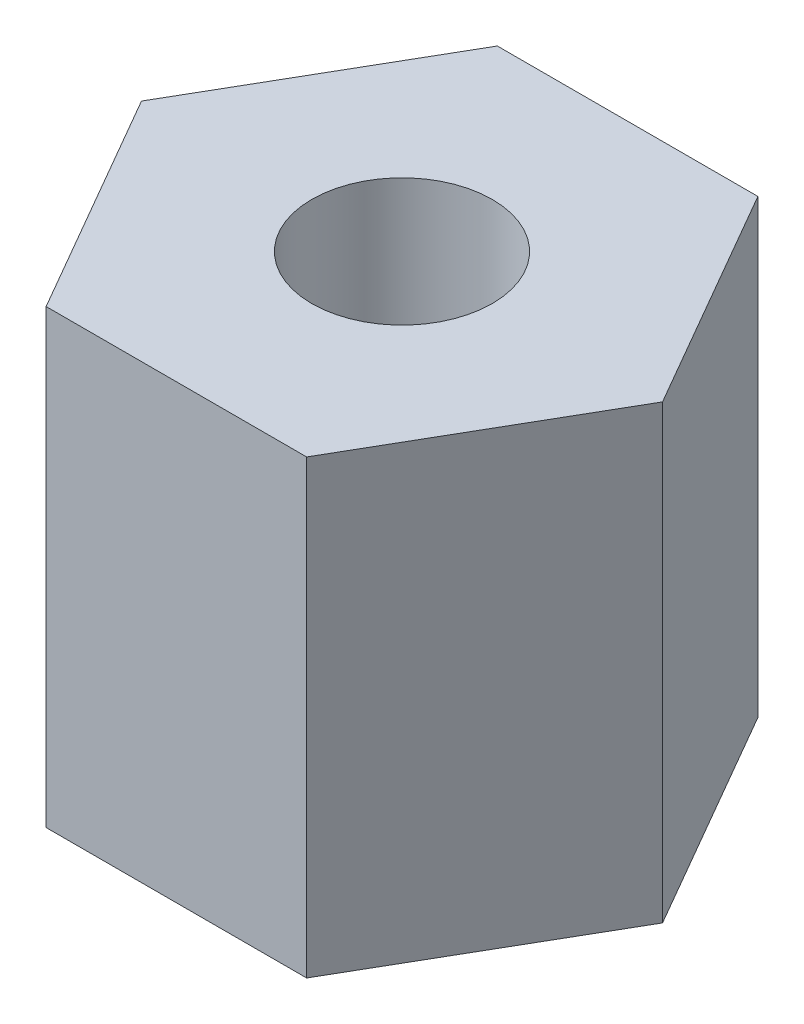
ISO-10303-21;
HEADER;
FILE_DESCRIPTION(('STEP AP214'),'2;1');
FILE_NAME('part.step','',(''),(''),'','','');
FILE_SCHEMA(('AUTOMOTIVE_DESIGN { 1 0 10303 214 1 1 1 1 }'));
ENDSEC;
DATA;
#1=APPLICATION_CONTEXT('core data for automotive mechanical design processes');
#2=APPLICATION_PROTOCOL_DEFINITION('international standard','automotive_design',2000,#1);
#3=PRODUCT_CONTEXT('',#1,'mechanical');
#4=PRODUCT('Part','Part','',(#3));
#5=PRODUCT_RELATED_PRODUCT_CATEGORY('part','',(#4));
#6=PRODUCT_DEFINITION_FORMATION('','',#4);
#7=PRODUCT_DEFINITION_CONTEXT('part definition',#1,'design');
#8=PRODUCT_DEFINITION('design','',#6,#7);
#9=PRODUCT_DEFINITION_SHAPE('','',#8);
#10=(LENGTH_UNIT() NAMED_UNIT(*) SI_UNIT(.MILLI.,.METRE.));
#11=(NAMED_UNIT(*) PLANE_ANGLE_UNIT() SI_UNIT($,.RADIAN.));
#12=(NAMED_UNIT(*) SI_UNIT($,.STERADIAN.) SOLID_ANGLE_UNIT());
#13=UNCERTAINTY_MEASURE_WITH_UNIT(LENGTH_MEASURE(1.E-05),#10,'distance_accuracy_value','');
#14=(GEOMETRIC_REPRESENTATION_CONTEXT(3) GLOBAL_UNCERTAINTY_ASSIGNED_CONTEXT((#13)) GLOBAL_UNIT_ASSIGNED_CONTEXT((#10,
#11,#12)) REPRESENTATION_CONTEXT('',''));
#15=CARTESIAN_POINT('',(0.,0.,0.));
#16=DIRECTION('',(0.,0.,1.));
#17=DIRECTION('',(1.,0.,0.));
#18=AXIS2_PLACEMENT_3D('',#15,#16,#17);
#19=CARTESIAN_POINT('',(14.4337567297407,50.,-25.));
#20=DIRECTION('',(0.,0.,1.));
#21=DIRECTION('',(1.,0.,0.));
#22=AXIS2_PLACEMENT_3D('',#19,#20,#21);
#23=PLANE('',#22);
#24=DIRECTION('',(-1.,0.,0.));
#25=VECTOR('',#24,1.);
#26=CARTESIAN_POINT('',(14.4337567297407,0.,-25.));
#27=LINE('',#26,#25);
#28=CARTESIAN_POINT('',(14.4337567297407,0.,-25.));
#29=VERTEX_POINT('',#28);
#30=CARTESIAN_POINT('',(-14.4337567297407,0.,-25.));
#31=VERTEX_POINT('',#30);
#32=EDGE_CURVE('E134',#29,#31,#27,.T.);
#33=ORIENTED_EDGE('',*,*,#32,.T.);
#34=DIRECTION('',(0.,-1.,0.));
#35=VECTOR('',#34,1.);
#36=CARTESIAN_POINT('',(-14.4337567297407,50.,-25.));
#37=LINE('',#36,#35);
#38=CARTESIAN_POINT('',(-14.4337567297407,50.,-25.));
#39=VERTEX_POINT('',#38);
#40=EDGE_CURVE('E11',#39,#31,#37,.T.);
#41=ORIENTED_EDGE('',*,*,#40,.F.);
#42=DIRECTION('',(-1.,0.,0.));
#43=VECTOR('',#42,1.);
#44=CARTESIAN_POINT('',(14.4337567297407,50.,-25.));
#45=LINE('',#44,#43);
#46=CARTESIAN_POINT('',(14.4337567297407,50.,-25.));
#47=VERTEX_POINT('',#46);
#48=EDGE_CURVE('E151',#47,#39,#45,.T.);
#49=ORIENTED_EDGE('',*,*,#48,.F.);
#50=DIRECTION('',(0.,-1.,0.));
#51=VECTOR('',#50,1.);
#52=CARTESIAN_POINT('',(14.4337567297407,50.,-25.));
#53=LINE('',#52,#51);
#54=EDGE_CURVE('E130',#47,#29,#53,.T.);
#55=ORIENTED_EDGE('',*,*,#54,.T.);
#56=EDGE_LOOP('',(#33,#41,#49,#55));
#57=FACE_BOUND('',#56,.T.);
#58=ADVANCED_FACE('F45',(#57),#23,.F.);
#59=CARTESIAN_POINT('',(-14.4337567297407,50.,-25.));
#60=DIRECTION('',(0.866025403784439,0.,0.5));
#61=DIRECTION('',(0.5,0.,-0.866025403784439));
#62=AXIS2_PLACEMENT_3D('',#59,#60,#61);
#63=PLANE('',#62);
#64=DIRECTION('',(-0.5,0.,0.866025403784439));
#65=VECTOR('',#64,1.);
#66=CARTESIAN_POINT('',(-14.4337567297407,0.,-25.));
#67=LINE('',#66,#65);
#68=CARTESIAN_POINT('',(-28.8675134594813,0.,0.));
#69=VERTEX_POINT('',#68);
#70=EDGE_CURVE('E138',#31,#69,#67,.T.);
#71=ORIENTED_EDGE('',*,*,#70,.T.);
#72=DIRECTION('',(0.,-1.,0.));
#73=VECTOR('',#72,1.);
#74=CARTESIAN_POINT('',(-28.8675134594813,50.,0.));
#75=LINE('',#74,#73);
#76=CARTESIAN_POINT('',(-28.8675134594813,50.,0.));
#77=VERTEX_POINT('',#76);
#78=EDGE_CURVE('E54',#77,#69,#75,.T.);
#79=ORIENTED_EDGE('',*,*,#78,.F.);
#80=DIRECTION('',(-0.5,0.,0.866025403784439));
#81=VECTOR('',#80,1.);
#82=CARTESIAN_POINT('',(-14.4337567297407,50.,-25.));
#83=LINE('',#82,#81);
#84=EDGE_CURVE('E99',#39,#77,#83,.T.);
#85=ORIENTED_EDGE('',*,*,#84,.F.);
#86=ORIENTED_EDGE('',*,*,#40,.T.);
#87=EDGE_LOOP('',(#71,#79,#85,#86));
#88=FACE_BOUND('',#87,.T.);
#89=ADVANCED_FACE('F180',(#88),#63,.F.);
#90=CARTESIAN_POINT('',(-28.8675134594813,50.,0.));
#91=DIRECTION('',(0.866025403784438,0.,-0.5));
#92=DIRECTION('',(-0.5,0.,-0.866025403784439));
#93=AXIS2_PLACEMENT_3D('',#90,#91,#92);
#94=PLANE('',#93);
#95=DIRECTION('',(0.5,0.,0.866025403784438));
#96=VECTOR('',#95,1.);
#97=CARTESIAN_POINT('',(-28.8675134594813,0.,0.));
#98=LINE('',#97,#96);
#99=CARTESIAN_POINT('',(-14.4337567297406,0.,25.));
#100=VERTEX_POINT('',#99);
#101=EDGE_CURVE('E142',#69,#100,#98,.T.);
#102=ORIENTED_EDGE('',*,*,#101,.T.);
#103=DIRECTION('',(0.,-1.,0.));
#104=VECTOR('',#103,1.);
#105=CARTESIAN_POINT('',(-14.4337567297406,50.,25.));
#106=LINE('',#105,#104);
#107=CARTESIAN_POINT('',(-14.4337567297406,50.,25.));
#108=VERTEX_POINT('',#107);
#109=EDGE_CURVE('E123',#108,#100,#106,.T.);
#110=ORIENTED_EDGE('',*,*,#109,.F.);
#111=DIRECTION('',(0.5,0.,0.866025403784438));
#112=VECTOR('',#111,1.);
#113=CARTESIAN_POINT('',(-28.8675134594813,50.,0.));
#114=LINE('',#113,#112);
#115=EDGE_CURVE('E112',#77,#108,#114,.T.);
#116=ORIENTED_EDGE('',*,*,#115,.F.);
#117=ORIENTED_EDGE('',*,*,#78,.T.);
#118=EDGE_LOOP('',(#102,#110,#116,#117));
#119=FACE_BOUND('',#118,.T.);
#120=ADVANCED_FACE('F161',(#119),#94,.F.);
#121=CARTESIAN_POINT('',(-14.4337567297406,50.,25.));
#122=DIRECTION('',(0.,0.,-1.));
#123=DIRECTION('',(-1.,0.,0.));
#124=AXIS2_PLACEMENT_3D('',#121,#122,#123);
#125=PLANE('',#124);
#126=DIRECTION('',(1.,0.,0.));
#127=VECTOR('',#126,1.);
#128=CARTESIAN_POINT('',(-14.4337567297406,0.,25.));
#129=LINE('',#128,#127);
#130=CARTESIAN_POINT('',(14.4337567297407,0.,25.));
#131=VERTEX_POINT('',#130);
#132=EDGE_CURVE('E121',#100,#131,#129,.T.);
#133=ORIENTED_EDGE('',*,*,#132,.T.);
#134=DIRECTION('',(0.,-1.,0.));
#135=VECTOR('',#134,1.);
#136=CARTESIAN_POINT('',(14.4337567297407,50.,25.));
#137=LINE('',#136,#135);
#138=CARTESIAN_POINT('',(14.4337567297407,50.,25.));
#139=VERTEX_POINT('',#138);
#140=EDGE_CURVE('E118',#139,#131,#137,.T.);
#141=ORIENTED_EDGE('',*,*,#140,.F.);
#142=DIRECTION('',(1.,0.,0.));
#143=VECTOR('',#142,1.);
#144=CARTESIAN_POINT('',(-14.4337567297406,50.,25.));
#145=LINE('',#144,#143);
#146=EDGE_CURVE('E106',#108,#139,#145,.T.);
#147=ORIENTED_EDGE('',*,*,#146,.F.);
#148=ORIENTED_EDGE('',*,*,#109,.T.);
#149=EDGE_LOOP('',(#133,#141,#147,#148));
#150=FACE_BOUND('',#149,.T.);
#151=ADVANCED_FACE('F119',(#150),#125,.F.);
#152=CARTESIAN_POINT('',(14.4337567297407,50.,25.));
#153=DIRECTION('',(-0.866025403784439,0.,-0.5));
#154=DIRECTION('',(-0.5,0.,0.866025403784439));
#155=AXIS2_PLACEMENT_3D('',#152,#153,#154);
#156=PLANE('',#155);
#157=DIRECTION('',(0.5,0.,-0.866025403784439));
#158=VECTOR('',#157,1.);
#159=CARTESIAN_POINT('',(14.4337567297407,0.,25.));
#160=LINE('',#159,#158);
#161=CARTESIAN_POINT('',(28.8675134594813,0.,0.));
#162=VERTEX_POINT('',#161);
#163=EDGE_CURVE('E85',#131,#162,#160,.T.);
#164=ORIENTED_EDGE('',*,*,#163,.T.);
#165=DIRECTION('',(0.,-1.,0.));
#166=VECTOR('',#165,1.);
#167=CARTESIAN_POINT('',(28.8675134594813,50.,0.));
#168=LINE('',#167,#166);
#169=CARTESIAN_POINT('',(28.8675134594813,50.,0.));
#170=VERTEX_POINT('',#169);
#171=EDGE_CURVE('E124',#170,#162,#168,.T.);
#172=ORIENTED_EDGE('',*,*,#171,.F.);
#173=DIRECTION('',(0.5,0.,-0.866025403784439));
#174=VECTOR('',#173,1.);
#175=CARTESIAN_POINT('',(14.4337567297407,50.,25.));
#176=LINE('',#175,#174);
#177=EDGE_CURVE('E110',#139,#170,#176,.T.);
#178=ORIENTED_EDGE('',*,*,#177,.F.);
#179=ORIENTED_EDGE('',*,*,#140,.T.);
#180=EDGE_LOOP('',(#164,#172,#178,#179));
#181=FACE_BOUND('',#180,.T.);
#182=ADVANCED_FACE('F126',(#181),#156,.F.);
#183=CARTESIAN_POINT('',(28.8675134594813,50.,0.));
#184=DIRECTION('',(-0.866025403784439,0.,0.5));
#185=DIRECTION('',(0.5,0.,0.866025403784439));
#186=AXIS2_PLACEMENT_3D('',#183,#184,#185);
#187=PLANE('',#186);
#188=DIRECTION('',(-0.5,0.,-0.866025403784439));
#189=VECTOR('',#188,1.);
#190=CARTESIAN_POINT('',(28.8675134594813,0.,0.));
#191=LINE('',#190,#189);
#192=EDGE_CURVE('E91',#162,#29,#191,.T.);
#193=ORIENTED_EDGE('',*,*,#192,.T.);
#194=ORIENTED_EDGE('',*,*,#54,.F.);
#195=DIRECTION('',(-0.5,0.,-0.866025403784439));
#196=VECTOR('',#195,1.);
#197=CARTESIAN_POINT('',(28.8675134594813,50.,0.));
#198=LINE('',#197,#196);
#199=EDGE_CURVE('E62',#170,#47,#198,.T.);
#200=ORIENTED_EDGE('',*,*,#199,.F.);
#201=ORIENTED_EDGE('',*,*,#171,.T.);
#202=EDGE_LOOP('',(#193,#194,#200,#201));
#203=FACE_BOUND('',#202,.T.);
#204=ADVANCED_FACE('F168',(#203),#187,.F.);
#205=CARTESIAN_POINT('',(0.,50.,0.));
#206=DIRECTION('',(0.,1.,0.));
#207=DIRECTION('',(0.,0.,1.));
#208=AXIS2_PLACEMENT_3D('',#205,#206,#207);
#209=PLANE('',#208);
#210=CARTESIAN_POINT('',(0.,50.,0.));
#211=DIRECTION('',(0.,1.,0.));
#212=DIRECTION('',(0.,0.,1.));
#213=AXIS2_PLACEMENT_3D('',#210,#211,#212);
#214=CIRCLE('',#213,10.);
#215=CARTESIAN_POINT('',(0.,50.,10.));
#216=VERTEX_POINT('',#215);
#217=EDGE_CURVE('E139',#216,#216,#214,.T.);
#218=ORIENTED_EDGE('',*,*,#217,.F.);
#219=EDGE_LOOP('',(#218));
#220=FACE_BOUND('',#219,.T.);
#221=ORIENTED_EDGE('',*,*,#48,.T.);
#222=ORIENTED_EDGE('',*,*,#84,.T.);
#223=ORIENTED_EDGE('',*,*,#115,.T.);
#224=ORIENTED_EDGE('',*,*,#146,.T.);
#225=ORIENTED_EDGE('',*,*,#177,.T.);
#226=ORIENTED_EDGE('',*,*,#199,.T.);
#227=EDGE_LOOP('',(#221,#222,#223,#224,#225,#226));
#228=FACE_BOUND('',#227,.T.);
#229=ADVANCED_FACE('F108',(#220,#228),#209,.T.);
#230=CARTESIAN_POINT('',(0.,0.,0.));
#231=DIRECTION('',(0.,1.,0.));
#232=DIRECTION('',(0.,0.,1.));
#233=AXIS2_PLACEMENT_3D('',#230,#231,#232);
#234=PLANE('',#233);
#235=CARTESIAN_POINT('',(0.,0.,0.));
#236=DIRECTION('',(0.,1.,0.));
#237=DIRECTION('',(0.,0.,1.));
#238=AXIS2_PLACEMENT_3D('',#235,#236,#237);
#239=CIRCLE('',#238,10.);
#240=CARTESIAN_POINT('',(0.,0.,10.));
#241=VERTEX_POINT('',#240);
#242=EDGE_CURVE('E236',#241,#241,#239,.T.);
#243=ORIENTED_EDGE('',*,*,#242,.T.);
#244=EDGE_LOOP('',(#243));
#245=FACE_BOUND('',#244,.T.);
#246=ORIENTED_EDGE('',*,*,#32,.F.);
#247=ORIENTED_EDGE('',*,*,#192,.F.);
#248=ORIENTED_EDGE('',*,*,#163,.F.);
#249=ORIENTED_EDGE('',*,*,#132,.F.);
#250=ORIENTED_EDGE('',*,*,#101,.F.);
#251=ORIENTED_EDGE('',*,*,#70,.F.);
#252=EDGE_LOOP('',(#246,#247,#248,#249,#250,#251));
#253=FACE_BOUND('',#252,.T.);
#254=ADVANCED_FACE('F164',(#245,#253),#234,.F.);
#255=CARTESIAN_POINT('',(0.,0.,0.));
#256=DIRECTION('',(0.,1.,0.));
#257=DIRECTION('',(0.,0.,1.));
#258=AXIS2_PLACEMENT_3D('',#255,#256,#257);
#259=CYLINDRICAL_SURFACE('',#258,10.);
#260=ORIENTED_EDGE('',*,*,#217,.T.);
#261=EDGE_LOOP('',(#260));
#262=FACE_BOUND('',#261,.T.);
#263=ORIENTED_EDGE('',*,*,#242,.F.);
#264=EDGE_LOOP('',(#263));
#265=FACE_BOUND('',#264,.T.);
#266=ADVANCED_FACE('F219',(#262,#265),#259,.F.);
#267=CLOSED_SHELL('',(#58,#89,#120,#151,#182,#204,#229,#254,#266));
#268=MANIFOLD_SOLID_BREP('B2',#267);
#269=ADVANCED_BREP_SHAPE_REPRESENTATION('',(#18,#268),#14);
#270=SHAPE_DEFINITION_REPRESENTATION(#9,#269);
ENDSEC;
END-ISO-10303-21;
